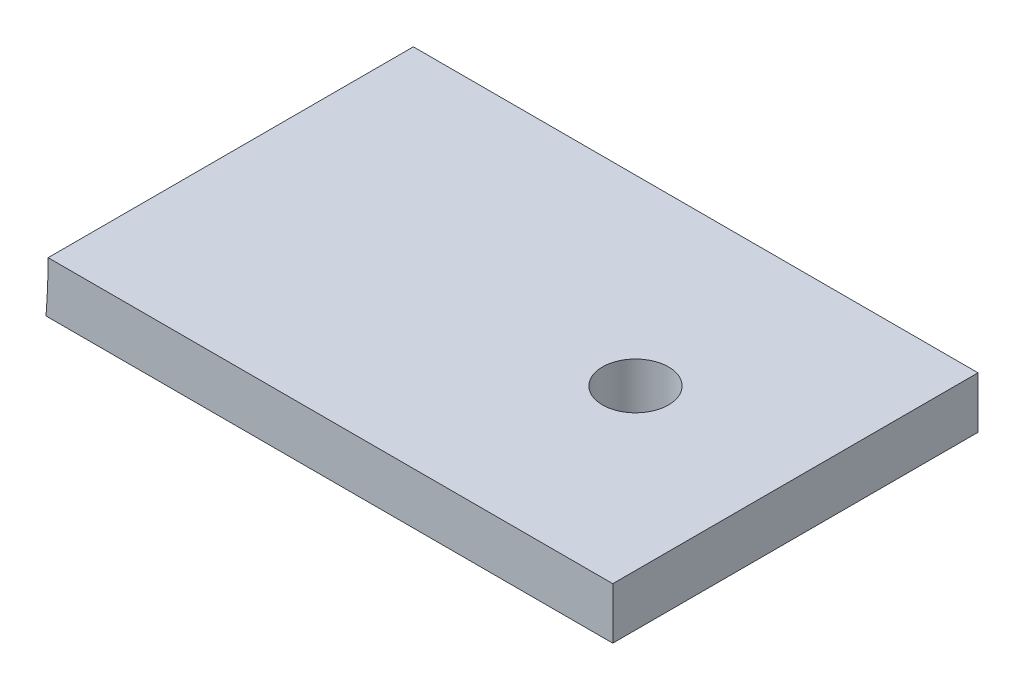
ISO-10303-21;
HEADER;
FILE_DESCRIPTION(('STEP AP214'),'2;1');
FILE_NAME('part.step','',(''),(''),'','','');
FILE_SCHEMA(('AUTOMOTIVE_DESIGN { 1 0 10303 214 1 1 1 1 }'));
ENDSEC;
DATA;
#1=APPLICATION_CONTEXT('core data for automotive mechanical design processes');
#2=APPLICATION_PROTOCOL_DEFINITION('international standard','automotive_design',2000,#1);
#3=PRODUCT_CONTEXT('',#1,'mechanical');
#4=PRODUCT('Part','Part','',(#3));
#5=PRODUCT_RELATED_PRODUCT_CATEGORY('part','',(#4));
#6=PRODUCT_DEFINITION_FORMATION('','',#4);
#7=PRODUCT_DEFINITION_CONTEXT('part definition',#1,'design');
#8=PRODUCT_DEFINITION('design','',#6,#7);
#9=PRODUCT_DEFINITION_SHAPE('','',#8);
#10=(LENGTH_UNIT() NAMED_UNIT(*) SI_UNIT(.MILLI.,.METRE.));
#11=(NAMED_UNIT(*) PLANE_ANGLE_UNIT() SI_UNIT($,.RADIAN.));
#12=(NAMED_UNIT(*) SI_UNIT($,.STERADIAN.) SOLID_ANGLE_UNIT());
#13=UNCERTAINTY_MEASURE_WITH_UNIT(LENGTH_MEASURE(1.E-05),#10,'distance_accuracy_value','');
#14=(GEOMETRIC_REPRESENTATION_CONTEXT(3) GLOBAL_UNCERTAINTY_ASSIGNED_CONTEXT((#13)) GLOBAL_UNIT_ASSIGNED_CONTEXT((#10,
#11,#12)) REPRESENTATION_CONTEXT('',''));
#15=CARTESIAN_POINT('',(0.,0.,0.));
#16=DIRECTION('',(0.,0.,1.));
#17=DIRECTION('',(1.,0.,0.));
#18=AXIS2_PLACEMENT_3D('',#15,#16,#17);
#19=CARTESIAN_POINT('',(29.656098874284,20.5,291556.514563107));
#20=DIRECTION('',(1.,0.,0.));
#21=DIRECTION('',(0.,0.,-1.));
#22=AXIS2_PLACEMENT_3D('',#19,#20,#21);
#23=PLANE('',#22);
#24=DIRECTION('',(0.,0.,-1.));
#25=VECTOR('',#24,1.);
#26=CARTESIAN_POINT('',(29.656098874284,21.75,291556.514563107));
#27=LINE('',#26,#25);
#28=CARTESIAN_POINT('',(29.656098874284,21.75,1.46192518337784));
#29=VERTEX_POINT('',#28);
#30=CARTESIAN_POINT('',(29.656098874284,21.75,-7.39382756529494));
#31=VERTEX_POINT('',#30);
#32=EDGE_CURVE('E57',#29,#31,#27,.T.);
#33=ORIENTED_EDGE('',*,*,#32,.F.);
#34=DIRECTION('',(0.,1.,0.));
#35=VECTOR('',#34,1.);
#36=CARTESIAN_POINT('',(29.656098874284,20.5,1.46192518337784));
#37=LINE('',#36,#35);
#38=CARTESIAN_POINT('',(29.656098874284,20.5,1.46192518337784));
#39=VERTEX_POINT('',#38);
#40=EDGE_CURVE('E70',#39,#29,#37,.T.);
#41=ORIENTED_EDGE('',*,*,#40,.F.);
#42=DIRECTION('',(0.,0.,-1.));
#43=VECTOR('',#42,1.);
#44=CARTESIAN_POINT('',(29.656098874284,20.5,291556.514563107));
#45=LINE('',#44,#43);
#46=CARTESIAN_POINT('',(29.656098874284,20.5,-7.39382756529494));
#47=VERTEX_POINT('',#46);
#48=EDGE_CURVE('E101',#39,#47,#45,.T.);
#49=ORIENTED_EDGE('',*,*,#48,.T.);
#50=DIRECTION('',(0.,1.,0.));
#51=VECTOR('',#50,1.);
#52=CARTESIAN_POINT('',(29.656098874284,20.5,-7.39382756529494));
#53=LINE('',#52,#51);
#54=EDGE_CURVE('E93',#47,#31,#53,.T.);
#55=ORIENTED_EDGE('',*,*,#54,.T.);
#56=EDGE_LOOP('',(#33,#41,#49,#55));
#57=FACE_BOUND('',#56,.T.);
#58=ADVANCED_FACE('F36',(#57),#23,.T.);
#59=CARTESIAN_POINT('',(25.7794462528693,25.5,-2.96595119095855));
#60=DIRECTION('',(0.,1.,0.));
#61=DIRECTION('',(0.,0.,1.));
#62=AXIS2_PLACEMENT_3D('',#59,#60,#61);
#63=CYLINDRICAL_SURFACE('',#62,0.799999999999999);
#64=CARTESIAN_POINT('',(25.7794462528693,21.75,-2.96595119095855));
#65=DIRECTION('',(0.,-1.,0.));
#66=DIRECTION('',(0.,0.,-1.));
#67=AXIS2_PLACEMENT_3D('',#64,#65,#66);
#68=CIRCLE('',#67,0.799999999999999);
#69=CARTESIAN_POINT('',(25.7794462528693,21.75,-3.76595119095855));
#70=VERTEX_POINT('',#69);
#71=EDGE_CURVE('E94',#70,#70,#68,.F.);
#72=ORIENTED_EDGE('',*,*,#71,.T.);
#73=EDGE_LOOP('',(#72));
#74=FACE_BOUND('',#73,.T.);
#75=CARTESIAN_POINT('',(25.7794462528693,20.5,-2.96595119095855));
#76=DIRECTION('',(0.,-1.,0.));
#77=DIRECTION('',(0.,0.,-1.));
#78=AXIS2_PLACEMENT_3D('',#75,#76,#77);
#79=CIRCLE('',#78,0.799999999999999);
#80=CARTESIAN_POINT('',(25.7794462528693,20.5,-3.76595119095855));
#81=VERTEX_POINT('',#80);
#82=EDGE_CURVE('E110',#81,#81,#79,.T.);
#83=ORIENTED_EDGE('',*,*,#82,.T.);
#84=EDGE_LOOP('',(#83));
#85=FACE_BOUND('',#84,.T.);
#86=ADVANCED_FACE('F118',(#74,#85),#63,.F.);
#87=CARTESIAN_POINT('',(0.,20.5,0.));
#88=DIRECTION('',(0.,-1.,0.));
#89=DIRECTION('',(0.,0.,-1.));
#90=AXIS2_PLACEMENT_3D('',#87,#88,#89);
#91=PLANE('',#90);
#92=ORIENTED_EDGE('',*,*,#82,.F.);
#93=EDGE_LOOP('',(#92));
#94=FACE_BOUND('',#93,.T.);
#95=ORIENTED_EDGE('',*,*,#48,.F.);
#96=DIRECTION('',(1.,0.,0.));
#97=VECTOR('',#96,1.);
#98=CARTESIAN_POINT('',(-400002.038834951,20.5,1.46192518337784));
#99=LINE('',#98,#97);
#100=CARTESIAN_POINT('',(15.9142014257676,20.5,1.46192518337784));
#101=VERTEX_POINT('',#100);
#102=EDGE_CURVE('E82',#101,#39,#99,.T.);
#103=ORIENTED_EDGE('',*,*,#102,.F.);
#104=DIRECTION('',(0.,0.,-1.));
#105=VECTOR('',#104,1.);
#106=CARTESIAN_POINT('',(15.9142014257676,20.5,3.56748567590681));
#107=LINE('',#106,#105);
#108=CARTESIAN_POINT('',(15.9142014257676,20.5,-7.39382756529494));
#109=VERTEX_POINT('',#108);
#110=EDGE_CURVE('E11',#101,#109,#107,.T.);
#111=ORIENTED_EDGE('',*,*,#110,.T.);
#112=DIRECTION('',(1.,0.,0.));
#113=VECTOR('',#112,1.);
#114=CARTESIAN_POINT('',(-400002.038834951,20.5,-7.39382756529494));
#115=LINE('',#114,#113);
#116=EDGE_CURVE('E87',#109,#47,#115,.T.);
#117=ORIENTED_EDGE('',*,*,#116,.T.);
#118=EDGE_LOOP('',(#95,#103,#111,#117));
#119=FACE_BOUND('',#118,.T.);
#120=ADVANCED_FACE('F38',(#94,#119),#91,.T.);
#121=CARTESIAN_POINT('',(-34.2277855679569,21.75,-40.4854368932039));
#122=DIRECTION('',(0.,-1.,0.));
#123=DIRECTION('',(0.,0.,-1.));
#124=AXIS2_PLACEMENT_3D('',#121,#122,#123);
#125=PLANE('',#124);
#126=ORIENTED_EDGE('',*,*,#71,.F.);
#127=EDGE_LOOP('',(#126));
#128=FACE_BOUND('',#127,.T.);
#129=DIRECTION('',(0.,0.,-1.));
#130=VECTOR('',#129,1.);
#131=CARTESIAN_POINT('',(15.9655162352662,21.75,3.56748567590681));
#132=LINE('',#131,#130);
#133=CARTESIAN_POINT('',(15.9655162352662,21.75,-7.39382756529494));
#134=VERTEX_POINT('',#133);
#135=CARTESIAN_POINT('',(15.9655162352662,21.75,1.46192518337784));
#136=VERTEX_POINT('',#135);
#137=EDGE_CURVE('E44',#134,#136,#132,.F.);
#138=ORIENTED_EDGE('',*,*,#137,.T.);
#139=DIRECTION('',(1.,0.,0.));
#140=VECTOR('',#139,1.);
#141=CARTESIAN_POINT('',(-400002.038834951,21.75,1.46192518337784));
#142=LINE('',#141,#140);
#143=EDGE_CURVE('E76',#136,#29,#142,.T.);
#144=ORIENTED_EDGE('',*,*,#143,.T.);
#145=ORIENTED_EDGE('',*,*,#32,.T.);
#146=DIRECTION('',(1.,0.,0.));
#147=VECTOR('',#146,1.);
#148=CARTESIAN_POINT('',(-400002.038834951,21.75,-7.39382756529494));
#149=LINE('',#148,#147);
#150=EDGE_CURVE('E51',#134,#31,#149,.T.);
#151=ORIENTED_EDGE('',*,*,#150,.F.);
#152=EDGE_LOOP('',(#138,#144,#145,#151));
#153=FACE_BOUND('',#152,.T.);
#154=ADVANCED_FACE('F116',(#128,#153),#125,.F.);
#155=CARTESIAN_POINT('',(-0.0344541676912807,21.7807750626998,3.56748567590681));
#156=DIRECTION('',(0.,0.,-1.));
#157=DIRECTION('',(-1.,0.,0.));
#158=AXIS2_PLACEMENT_3D('',#155,#156,#157);
#159=CYLINDRICAL_SURFACE('',#158,16.);
#160=CARTESIAN_POINT('',(-0.0344541676912807,21.7807750626998,1.46192518337784));
#161=DIRECTION('',(0.,0.,-1.));
#162=DIRECTION('',(-1.,0.,0.));
#163=AXIS2_PLACEMENT_3D('',#160,#161,#162);
#164=CIRCLE('',#163,16.);
#165=EDGE_CURVE('E99',#136,#101,#164,.T.);
#166=ORIENTED_EDGE('',*,*,#165,.F.);
#167=ORIENTED_EDGE('',*,*,#137,.F.);
#168=CARTESIAN_POINT('',(-0.0344541676912807,21.7807750626998,-7.39382756529494));
#169=DIRECTION('',(0.,0.,1.));
#170=DIRECTION('',(1.,0.,0.));
#171=AXIS2_PLACEMENT_3D('',#168,#169,#170);
#172=CIRCLE('',#171,16.);
#173=EDGE_CURVE('E90',#109,#134,#172,.T.);
#174=ORIENTED_EDGE('',*,*,#173,.F.);
#175=ORIENTED_EDGE('',*,*,#110,.F.);
#176=EDGE_LOOP('',(#166,#167,#174,#175));
#177=FACE_BOUND('',#176,.T.);
#178=ADVANCED_FACE('F98',(#177),#159,.F.);
#179=CARTESIAN_POINT('',(-400002.038834951,20.5,-7.39382756529494));
#180=DIRECTION('',(0.,0.,1.));
#181=DIRECTION('',(1.,0.,0.));
#182=AXIS2_PLACEMENT_3D('',#179,#180,#181);
#183=PLANE('',#182);
#184=ORIENTED_EDGE('',*,*,#116,.F.);
#185=ORIENTED_EDGE('',*,*,#173,.T.);
#186=ORIENTED_EDGE('',*,*,#150,.T.);
#187=ORIENTED_EDGE('',*,*,#54,.F.);
#188=EDGE_LOOP('',(#184,#185,#186,#187));
#189=FACE_BOUND('',#188,.T.);
#190=ADVANCED_FACE('F88',(#189),#183,.F.);
#191=CARTESIAN_POINT('',(-400002.038834951,20.5,1.46192518337784));
#192=DIRECTION('',(0.,0.,1.));
#193=DIRECTION('',(1.,0.,0.));
#194=AXIS2_PLACEMENT_3D('',#191,#192,#193);
#195=PLANE('',#194);
#196=ORIENTED_EDGE('',*,*,#143,.F.);
#197=ORIENTED_EDGE('',*,*,#165,.T.);
#198=ORIENTED_EDGE('',*,*,#102,.T.);
#199=ORIENTED_EDGE('',*,*,#40,.T.);
#200=EDGE_LOOP('',(#196,#197,#198,#199));
#201=FACE_BOUND('',#200,.T.);
#202=ADVANCED_FACE('F115',(#201),#195,.T.);
#203=CLOSED_SHELL('',(#58,#86,#120,#154,#178,#190,#202));
#204=MANIFOLD_SOLID_BREP('B2',#203);
#205=ADVANCED_BREP_SHAPE_REPRESENTATION('',(#18,#204),#14);
#206=SHAPE_DEFINITION_REPRESENTATION(#9,#205);
ENDSEC;
END-ISO-10303-21;
